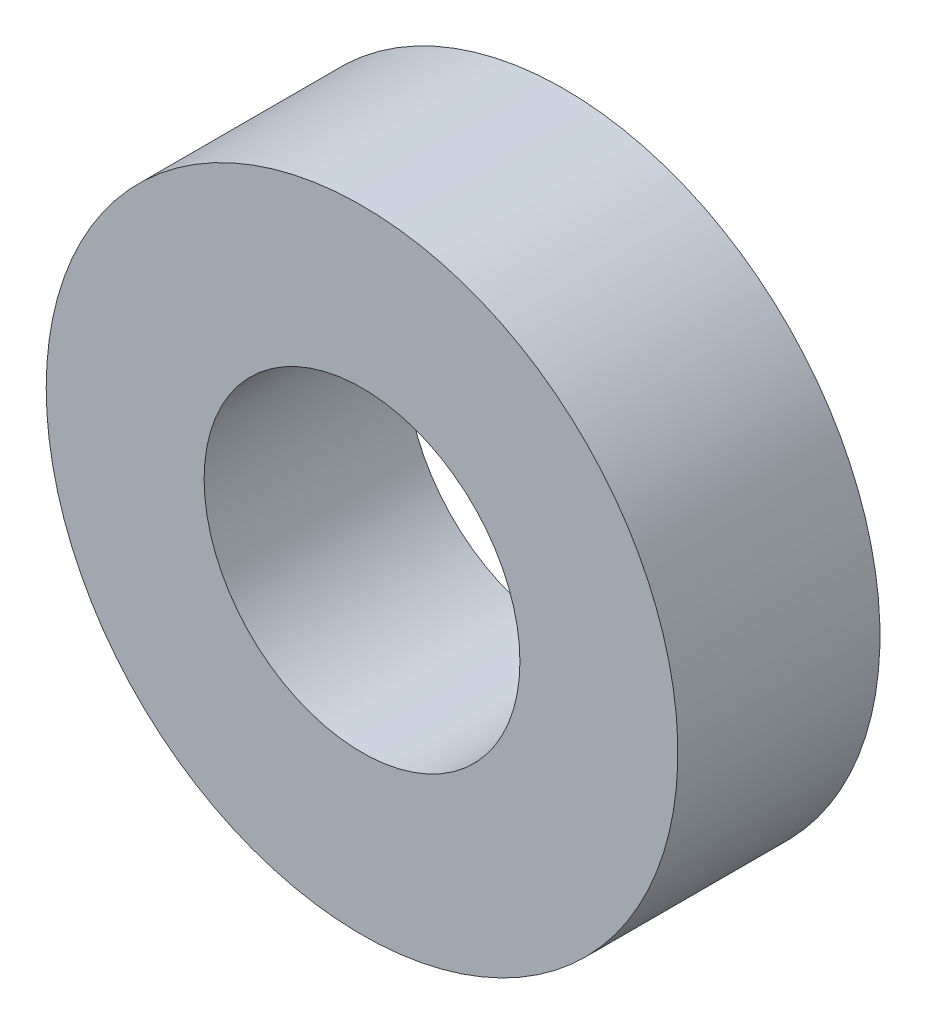
ISO-10303-21;
HEADER;
FILE_DESCRIPTION(('STEP AP214'),'2;1');
FILE_NAME('part.step','',(''),(''),'','','');
FILE_SCHEMA(('AUTOMOTIVE_DESIGN { 1 0 10303 214 1 1 1 1 }'));
ENDSEC;
DATA;
#1=APPLICATION_CONTEXT('core data for automotive mechanical design processes');
#2=APPLICATION_PROTOCOL_DEFINITION('international standard','automotive_design',2000,#1);
#3=PRODUCT_CONTEXT('',#1,'mechanical');
#4=PRODUCT('Part','Part','',(#3));
#5=PRODUCT_RELATED_PRODUCT_CATEGORY('part','',(#4));
#6=PRODUCT_DEFINITION_FORMATION('','',#4);
#7=PRODUCT_DEFINITION_CONTEXT('part definition',#1,'design');
#8=PRODUCT_DEFINITION('design','',#6,#7);
#9=PRODUCT_DEFINITION_SHAPE('','',#8);
#10=(LENGTH_UNIT() NAMED_UNIT(*) SI_UNIT(.MILLI.,.METRE.));
#11=(NAMED_UNIT(*) PLANE_ANGLE_UNIT() SI_UNIT($,.RADIAN.));
#12=(NAMED_UNIT(*) SI_UNIT($,.STERADIAN.) SOLID_ANGLE_UNIT());
#13=UNCERTAINTY_MEASURE_WITH_UNIT(LENGTH_MEASURE(1.E-05),#10,'distance_accuracy_value','');
#14=(GEOMETRIC_REPRESENTATION_CONTEXT(3) GLOBAL_UNCERTAINTY_ASSIGNED_CONTEXT((#13)) GLOBAL_UNIT_ASSIGNED_CONTEXT((#10,
#11,#12)) REPRESENTATION_CONTEXT('',''));
#15=CARTESIAN_POINT('',(0.,0.,0.));
#16=DIRECTION('',(0.,0.,1.));
#17=DIRECTION('',(1.,0.,0.));
#18=AXIS2_PLACEMENT_3D('',#15,#16,#17);
#19=CARTESIAN_POINT('',(0.,0.,15.9999999999999));
#20=DIRECTION('',(0.,0.,1.));
#21=DIRECTION('',(0.999999999999999,0.,0.));
#22=AXIS2_PLACEMENT_3D('',#19,#20,#21);
#23=PLANE('',#22);
#24=CARTESIAN_POINT('',(0.,0.,15.9999999999999));
#25=DIRECTION('',(0.,0.,1.));
#26=DIRECTION('',(0.999999999999999,0.,0.));
#27=AXIS2_PLACEMENT_3D('',#24,#25,#26);
#28=CIRCLE('',#27,25.);
#29=CARTESIAN_POINT('',(-25.,0.,15.9999999999999));
#30=VERTEX_POINT('',#29);
#31=EDGE_CURVE('E10',#30,#30,#28,.T.);
#32=ORIENTED_EDGE('',*,*,#31,.T.);
#33=EDGE_LOOP('',(#32));
#34=FACE_BOUND('',#33,.T.);
#35=CARTESIAN_POINT('',(0.,0.,15.9999999999999));
#36=DIRECTION('',(0.,0.,1.));
#37=DIRECTION('',(0.999999999999999,0.,0.));
#38=AXIS2_PLACEMENT_3D('',#35,#36,#37);
#39=CIRCLE('',#38,12.5);
#40=CARTESIAN_POINT('',(-12.5,0.,15.9999999999999));
#41=VERTEX_POINT('',#40);
#42=EDGE_CURVE('E48',#41,#41,#39,.T.);
#43=ORIENTED_EDGE('',*,*,#42,.F.);
#44=EDGE_LOOP('',(#43));
#45=FACE_BOUND('',#44,.T.);
#46=ADVANCED_FACE('F37',(#34,#45),#23,.T.);
#47=CARTESIAN_POINT('',(0.,0.,0.));
#48=DIRECTION('',(0.,0.,1.));
#49=DIRECTION('',(0.999999999999999,0.,0.));
#50=AXIS2_PLACEMENT_3D('',#47,#48,#49);
#51=PLANE('',#50);
#52=CARTESIAN_POINT('',(0.,0.,0.));
#53=DIRECTION('',(0.,0.,1.));
#54=DIRECTION('',(0.999999999999999,0.,0.));
#55=AXIS2_PLACEMENT_3D('',#52,#53,#54);
#56=CIRCLE('',#55,25.);
#57=CARTESIAN_POINT('',(-25.,0.,0.));
#58=VERTEX_POINT('',#57);
#59=EDGE_CURVE('E41',#58,#58,#56,.T.);
#60=ORIENTED_EDGE('',*,*,#59,.F.);
#61=EDGE_LOOP('',(#60));
#62=FACE_BOUND('',#61,.T.);
#63=CARTESIAN_POINT('',(0.,0.,0.));
#64=DIRECTION('',(0.,0.,1.));
#65=DIRECTION('',(0.999999999999999,0.,0.));
#66=AXIS2_PLACEMENT_3D('',#63,#64,#65);
#67=CIRCLE('',#66,12.5);
#68=CARTESIAN_POINT('',(-12.5,0.,0.));
#69=VERTEX_POINT('',#68);
#70=EDGE_CURVE('E50',#69,#69,#67,.T.);
#71=ORIENTED_EDGE('',*,*,#70,.T.);
#72=EDGE_LOOP('',(#71));
#73=FACE_BOUND('',#72,.T.);
#74=ADVANCED_FACE('F60',(#62,#73),#51,.F.);
#75=CARTESIAN_POINT('',(0.,0.,15.9999999999999));
#76=DIRECTION('',(0.,0.,-1.));
#77=DIRECTION('',(-0.999999999999999,0.,0.));
#78=AXIS2_PLACEMENT_3D('',#75,#76,#77);
#79=CYLINDRICAL_SURFACE('',#78,25.);
#80=CARTESIAN_POINT('',(-25.,0.,15.9999999999999));
#81=CARTESIAN_POINT('',(-25.,0.,15.8333333333332));
#82=CARTESIAN_POINT('',(-25.,0.,15.6666666666666));
#83=CARTESIAN_POINT('',(-25.,0.,15.3333333333332));
#84=CARTESIAN_POINT('',(-25.,0.,15.1666666666666));
#85=CARTESIAN_POINT('',(-25.,0.,14.8333333333332));
#86=CARTESIAN_POINT('',(-25.,0.,14.6666666666666));
#87=CARTESIAN_POINT('',(-25.,0.,14.3333333333332));
#88=CARTESIAN_POINT('',(-25.,0.,14.1666666666666));
#89=CARTESIAN_POINT('',(-25.,0.,13.8333333333333));
#90=CARTESIAN_POINT('',(-25.,0.,13.6666666666666));
#91=CARTESIAN_POINT('',(-25.,0.,13.3333333333333));
#92=CARTESIAN_POINT('',(-25.,0.,13.1666666666666));
#93=CARTESIAN_POINT('',(-25.,0.,12.8333333333333));
#94=CARTESIAN_POINT('',(-25.,0.,12.6666666666666));
#95=CARTESIAN_POINT('',(-25.,0.,12.3333333333333));
#96=CARTESIAN_POINT('',(-25.,0.,12.1666666666666));
#97=CARTESIAN_POINT('',(-25.,0.,11.8333333333333));
#98=CARTESIAN_POINT('',(-25.,0.,11.6666666666666));
#99=CARTESIAN_POINT('',(-25.,0.,11.3333333333333));
#100=CARTESIAN_POINT('',(-25.,0.,11.1666666666666));
#101=CARTESIAN_POINT('',(-25.,0.,10.8333333333333));
#102=CARTESIAN_POINT('',(-25.,0.,10.6666666666666));
#103=CARTESIAN_POINT('',(-25.,0.,10.3333333333333));
#104=CARTESIAN_POINT('',(-25.,0.,10.1666666666666));
#105=CARTESIAN_POINT('',(-25.,0.,9.83333333333328));
#106=CARTESIAN_POINT('',(-25.,0.,9.66666666666661));
#107=CARTESIAN_POINT('',(-25.,0.,9.33333333333328));
#108=CARTESIAN_POINT('',(-25.,0.,9.16666666666661));
#109=CARTESIAN_POINT('',(-25.,0.,8.83333333333328));
#110=CARTESIAN_POINT('',(-25.,0.,8.66666666666662));
#111=CARTESIAN_POINT('',(-25.,0.,8.33333333333328));
#112=CARTESIAN_POINT('',(-25.,0.,8.16666666666662));
#113=CARTESIAN_POINT('',(-25.,0.,7.83333333333329));
#114=CARTESIAN_POINT('',(-25.,0.,7.66666666666662));
#115=CARTESIAN_POINT('',(-25.,0.,7.33333333333329));
#116=CARTESIAN_POINT('',(-25.,0.,7.16666666666663));
#117=CARTESIAN_POINT('',(-25.,0.,6.83333333333329));
#118=CARTESIAN_POINT('',(-25.,0.,6.66666666666663));
#119=CARTESIAN_POINT('',(-25.,0.,6.3333333333333));
#120=CARTESIAN_POINT('',(-25.,0.,6.16666666666663));
#121=CARTESIAN_POINT('',(-25.,0.,5.8333333333333));
#122=CARTESIAN_POINT('',(-25.,0.,5.66666666666663));
#123=CARTESIAN_POINT('',(-25.,0.,5.3333333333333));
#124=CARTESIAN_POINT('',(-25.,0.,5.16666666666664));
#125=CARTESIAN_POINT('',(-25.,0.,4.83333333333331));
#126=CARTESIAN_POINT('',(-25.,0.,4.66666666666664));
#127=CARTESIAN_POINT('',(-25.,0.,4.33333333333331));
#128=CARTESIAN_POINT('',(-25.,0.,4.16666666666664));
#129=CARTESIAN_POINT('',(-25.,0.,3.83333333333331));
#130=CARTESIAN_POINT('',(-25.,0.,3.66666666666665));
#131=CARTESIAN_POINT('',(-25.,0.,3.33333333333331));
#132=CARTESIAN_POINT('',(-25.,0.,3.16666666666665));
#133=CARTESIAN_POINT('',(-25.,0.,2.83333333333332));
#134=CARTESIAN_POINT('',(-25.,0.,2.66666666666665));
#135=CARTESIAN_POINT('',(-25.,0.,2.33333333333332));
#136=CARTESIAN_POINT('',(-25.,0.,2.16666666666666));
#137=CARTESIAN_POINT('',(-25.,0.,1.83333333333332));
#138=CARTESIAN_POINT('',(-25.,0.,1.66666666666666));
#139=CARTESIAN_POINT('',(-25.,0.,1.33333333333333));
#140=CARTESIAN_POINT('',(-25.,0.,1.16666666666666));
#141=CARTESIAN_POINT('',(-25.,0.,0.83333333333333));
#142=CARTESIAN_POINT('',(-25.,0.,0.666666666666664));
#143=CARTESIAN_POINT('',(-25.,0.,0.333333333333334));
#144=CARTESIAN_POINT('',(-25.,0.,0.166666666666669));
#145=CARTESIAN_POINT('',(-25.,0.,0.));
#146=B_SPLINE_CURVE_WITH_KNOTS('',3,(#80,#81,#82,#83,#84,#85,#86,#87,#88,#89,#90,#91,#92,#93,
#94,#95,#96,#97,#98,#99,#100,#101,#102,#103,#104,#105,#106,#107,#108,#109,#110,#111,#112,#113,
#114,#115,#116,#117,#118,#119,#120,#121,#122,#123,#124,#125,#126,#127,#128,#129,#130,#131,#132,
#133,#134,#135,#136,#137,#138,#139,#140,#141,#142,#143,#144,#145),.UNSPECIFIED.,.F.,.F.,(4,2,2,
2,2,2,2,2,2,2,2,2,2,2,2,2,2,2,2,2,2,2,2,2,2,2,2,2,2,2,2,2,4),(0.,0.499999999999999,
0.999999999999996,1.49999999999999,1.99999999999999,2.49999999999999,2.99999999999998,
3.49999999999998,3.99999999999998,4.49999999999997,4.99999999999997,5.49999999999997,
5.99999999999997,6.49999999999996,6.99999999999996,7.49999999999996,7.99999999999995,
8.49999999999995,8.99999999999995,9.49999999999994,9.99999999999994,10.4999999999999,
10.9999999999999,11.4999999999999,11.9999999999999,12.4999999999999,12.9999999999999,
13.4999999999999,13.9999999999999,14.4999999999999,14.9999999999999,15.4999999999999,
15.9999999999999),.UNSPECIFIED.);
#147=EDGE_CURVE('BSEAM39',#30,#58,#146,.T.);
#148=ORIENTED_EDGE('',*,*,#31,.F.);
#149=ORIENTED_EDGE('',*,*,#59,.T.);
#150=ORIENTED_EDGE('',*,*,#147,.T.);
#151=ORIENTED_EDGE('',*,*,#147,.F.);
#152=EDGE_LOOP('',(#148,#150,#149,#151));
#153=FACE_BOUND('',#152,.T.);
#154=ADVANCED_FACE('F39',(#153),#79,.T.);
#155=CARTESIAN_POINT('',(0.,0.,15.9999999999999));
#156=DIRECTION('',(0.,0.,-1.));
#157=DIRECTION('',(-0.999999999999999,0.,0.));
#158=AXIS2_PLACEMENT_3D('',#155,#156,#157);
#159=CYLINDRICAL_SURFACE('',#158,12.5);
#160=CARTESIAN_POINT('',(-12.5,0.,15.9999999999999));
#161=CARTESIAN_POINT('',(-12.5,0.,15.8333333333332));
#162=CARTESIAN_POINT('',(-12.5,0.,15.6666666666666));
#163=CARTESIAN_POINT('',(-12.5,0.,15.3333333333332));
#164=CARTESIAN_POINT('',(-12.5,0.,15.1666666666666));
#165=CARTESIAN_POINT('',(-12.5,0.,14.8333333333332));
#166=CARTESIAN_POINT('',(-12.5,0.,14.6666666666666));
#167=CARTESIAN_POINT('',(-12.5,0.,14.3333333333332));
#168=CARTESIAN_POINT('',(-12.5,0.,14.1666666666666));
#169=CARTESIAN_POINT('',(-12.5,0.,13.8333333333333));
#170=CARTESIAN_POINT('',(-12.5,0.,13.6666666666666));
#171=CARTESIAN_POINT('',(-12.5,0.,13.3333333333333));
#172=CARTESIAN_POINT('',(-12.5,0.,13.1666666666666));
#173=CARTESIAN_POINT('',(-12.5,0.,12.8333333333333));
#174=CARTESIAN_POINT('',(-12.5,0.,12.6666666666666));
#175=CARTESIAN_POINT('',(-12.5,0.,12.3333333333333));
#176=CARTESIAN_POINT('',(-12.5,0.,12.1666666666666));
#177=CARTESIAN_POINT('',(-12.5,0.,11.8333333333333));
#178=CARTESIAN_POINT('',(-12.5,0.,11.6666666666666));
#179=CARTESIAN_POINT('',(-12.5,0.,11.3333333333333));
#180=CARTESIAN_POINT('',(-12.5,0.,11.1666666666666));
#181=CARTESIAN_POINT('',(-12.5,0.,10.8333333333333));
#182=CARTESIAN_POINT('',(-12.5,0.,10.6666666666666));
#183=CARTESIAN_POINT('',(-12.5,0.,10.3333333333333));
#184=CARTESIAN_POINT('',(-12.5,0.,10.1666666666666));
#185=CARTESIAN_POINT('',(-12.5,0.,9.83333333333327));
#186=CARTESIAN_POINT('',(-12.5,0.,9.66666666666661));
#187=CARTESIAN_POINT('',(-12.5,0.,9.33333333333328));
#188=CARTESIAN_POINT('',(-12.5,0.,9.16666666666661));
#189=CARTESIAN_POINT('',(-12.5,0.,8.83333333333328));
#190=CARTESIAN_POINT('',(-12.5,0.,8.66666666666661));
#191=CARTESIAN_POINT('',(-12.5,0.,8.33333333333328));
#192=CARTESIAN_POINT('',(-12.5,0.,8.16666666666662));
#193=CARTESIAN_POINT('',(-12.5,0.,7.83333333333329));
#194=CARTESIAN_POINT('',(-12.5,0.,7.66666666666662));
#195=CARTESIAN_POINT('',(-12.5,0.,7.33333333333329));
#196=CARTESIAN_POINT('',(-12.5,0.,7.16666666666662));
#197=CARTESIAN_POINT('',(-12.5,0.,6.83333333333329));
#198=CARTESIAN_POINT('',(-12.5,0.,6.66666666666663));
#199=CARTESIAN_POINT('',(-12.5,0.,6.33333333333329));
#200=CARTESIAN_POINT('',(-12.5,0.,6.16666666666663));
#201=CARTESIAN_POINT('',(-12.5,0.,5.8333333333333));
#202=CARTESIAN_POINT('',(-12.5,0.,5.66666666666663));
#203=CARTESIAN_POINT('',(-12.5,0.,5.3333333333333));
#204=CARTESIAN_POINT('',(-12.5,0.,5.16666666666663));
#205=CARTESIAN_POINT('',(-12.5,0.,4.8333333333333));
#206=CARTESIAN_POINT('',(-12.5,0.,4.66666666666664));
#207=CARTESIAN_POINT('',(-12.5,0.,4.33333333333331));
#208=CARTESIAN_POINT('',(-12.5,0.,4.16666666666664));
#209=CARTESIAN_POINT('',(-12.5,0.,3.83333333333331));
#210=CARTESIAN_POINT('',(-12.5,0.,3.66666666666664));
#211=CARTESIAN_POINT('',(-12.5,0.,3.33333333333331));
#212=CARTESIAN_POINT('',(-12.5,0.,3.16666666666665));
#213=CARTESIAN_POINT('',(-12.5,0.,2.83333333333331));
#214=CARTESIAN_POINT('',(-12.5,0.,2.66666666666665));
#215=CARTESIAN_POINT('',(-12.5,0.,2.33333333333332));
#216=CARTESIAN_POINT('',(-12.5,0.,2.16666666666665));
#217=CARTESIAN_POINT('',(-12.5,0.,1.83333333333332));
#218=CARTESIAN_POINT('',(-12.5,0.,1.66666666666666));
#219=CARTESIAN_POINT('',(-12.5,0.,1.33333333333332));
#220=CARTESIAN_POINT('',(-12.5,0.,1.16666666666666));
#221=CARTESIAN_POINT('',(-12.5,0.,0.833333333333327));
#222=CARTESIAN_POINT('',(-12.5,0.,0.666666666666661));
#223=CARTESIAN_POINT('',(-12.5,0.,0.33333333333333));
#224=CARTESIAN_POINT('',(-12.5,0.,0.166666666666665));
#225=CARTESIAN_POINT('',(-12.5,0.,0.));
#226=B_SPLINE_CURVE_WITH_KNOTS('',3,(#160,#161,#162,#163,#164,#165,#166,#167,#168,#169,#170,
#171,#172,#173,#174,#175,#176,#177,#178,#179,#180,#181,#182,#183,#184,#185,#186,#187,#188,#189,
#190,#191,#192,#193,#194,#195,#196,#197,#198,#199,#200,#201,#202,#203,#204,#205,#206,#207,#208,
#209,#210,#211,#212,#213,#214,#215,#216,#217,#218,#219,#220,#221,#222,#223,#224,#225),
.UNSPECIFIED.,.F.,.F.,(4,2,2,2,2,2,2,2,2,2,2,2,2,2,2,2,2,2,2,2,2,2,2,2,2,2,2,2,2,2,2,2,4),(0.,
0.499999999999999,0.999999999999996,1.49999999999999,1.99999999999999,2.49999999999999,
2.99999999999998,3.49999999999998,3.99999999999998,4.49999999999998,4.99999999999997,
5.49999999999997,5.99999999999997,6.49999999999996,6.99999999999996,7.49999999999996,
7.99999999999995,8.49999999999995,8.99999999999995,9.49999999999995,9.99999999999994,
10.4999999999999,10.9999999999999,11.4999999999999,11.9999999999999,12.4999999999999,
12.9999999999999,13.4999999999999,13.9999999999999,14.4999999999999,14.9999999999999,
15.4999999999999,15.9999999999999),.UNSPECIFIED.);
#227=EDGE_CURVE('BSEAM56',#41,#69,#226,.T.);
#228=ORIENTED_EDGE('',*,*,#42,.T.);
#229=ORIENTED_EDGE('',*,*,#70,.F.);
#230=ORIENTED_EDGE('',*,*,#227,.T.);
#231=ORIENTED_EDGE('',*,*,#227,.F.);
#232=EDGE_LOOP('',(#228,#230,#229,#231));
#233=FACE_BOUND('',#232,.T.);
#234=ADVANCED_FACE('F56',(#233),#159,.F.);
#235=CLOSED_SHELL('',(#46,#74,#154,#234));
#236=MANIFOLD_SOLID_BREP('B2',#235);
#237=ADVANCED_BREP_SHAPE_REPRESENTATION('',(#18,#236),#14);
#238=SHAPE_DEFINITION_REPRESENTATION(#9,#237);
ENDSEC;
END-ISO-10303-21;
